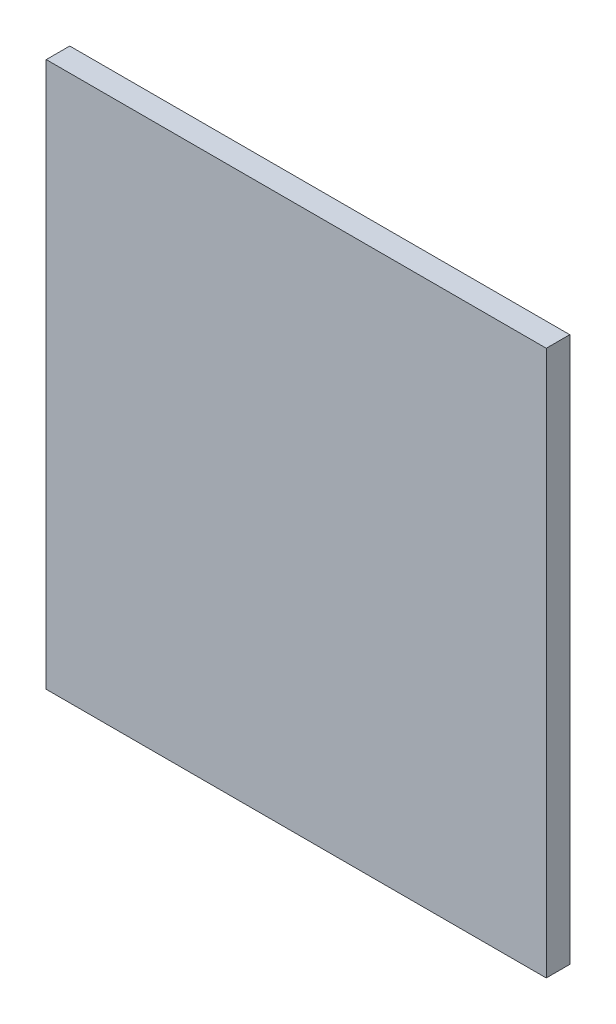
ISO-10303-21;
HEADER;
FILE_DESCRIPTION(('STEP AP214'),'2;1');
FILE_NAME('part.step','',(''),(''),'','','');
FILE_SCHEMA(('AUTOMOTIVE_DESIGN { 1 0 10303 214 1 1 1 1 }'));
ENDSEC;
DATA;
#1=APPLICATION_CONTEXT('core data for automotive mechanical design processes');
#2=APPLICATION_PROTOCOL_DEFINITION('international standard','automotive_design',2000,#1);
#3=PRODUCT_CONTEXT('',#1,'mechanical');
#4=PRODUCT('Part','Part','',(#3));
#5=PRODUCT_RELATED_PRODUCT_CATEGORY('part','',(#4));
#6=PRODUCT_DEFINITION_FORMATION('','',#4);
#7=PRODUCT_DEFINITION_CONTEXT('part definition',#1,'design');
#8=PRODUCT_DEFINITION('design','',#6,#7);
#9=PRODUCT_DEFINITION_SHAPE('','',#8);
#10=(LENGTH_UNIT() NAMED_UNIT(*) SI_UNIT(.MILLI.,.METRE.));
#11=(NAMED_UNIT(*) PLANE_ANGLE_UNIT() SI_UNIT($,.RADIAN.));
#12=(NAMED_UNIT(*) SI_UNIT($,.STERADIAN.) SOLID_ANGLE_UNIT());
#13=UNCERTAINTY_MEASURE_WITH_UNIT(LENGTH_MEASURE(1.E-05),#10,'distance_accuracy_value','');
#14=(GEOMETRIC_REPRESENTATION_CONTEXT(3) GLOBAL_UNCERTAINTY_ASSIGNED_CONTEXT((#13)) GLOBAL_UNIT_ASSIGNED_CONTEXT((#10,
#11,#12)) REPRESENTATION_CONTEXT('',''));
#15=CARTESIAN_POINT('',(0.,0.,0.));
#16=DIRECTION('',(0.,0.,1.));
#17=DIRECTION('',(1.,0.,0.));
#18=AXIS2_PLACEMENT_3D('',#15,#16,#17);
#19=CARTESIAN_POINT('',(1.0635,0.,0.05));
#20=DIRECTION('',(-1.,0.,0.));
#21=DIRECTION('',(0.,0.,1.));
#22=AXIS2_PLACEMENT_3D('',#19,#20,#21);
#23=PLANE('',#22);
#24=DIRECTION('',(0.,0.,-1.));
#25=VECTOR('',#24,1.);
#26=CARTESIAN_POINT('',(1.0635,-1.16,0.05));
#27=LINE('',#26,#25);
#28=CARTESIAN_POINT('',(1.0635,-1.16,0.1));
#29=VERTEX_POINT('',#28);
#30=CARTESIAN_POINT('',(1.0635,-1.16,0.));
#31=VERTEX_POINT('',#30);
#32=EDGE_CURVE('E68',#29,#31,#27,.T.);
#33=ORIENTED_EDGE('',*,*,#32,.T.);
#34=DIRECTION('',(0.,-1.,0.));
#35=VECTOR('',#34,1.);
#36=CARTESIAN_POINT('',(1.0635,0.,0.));
#37=LINE('',#36,#35);
#38=CARTESIAN_POINT('',(1.0635,1.16,0.));
#39=VERTEX_POINT('',#38);
#40=EDGE_CURVE('E88',#39,#31,#37,.T.);
#41=ORIENTED_EDGE('',*,*,#40,.F.);
#42=DIRECTION('',(0.,0.,-1.));
#43=VECTOR('',#42,1.);
#44=CARTESIAN_POINT('',(1.0635,1.16,0.05));
#45=LINE('',#44,#43);
#46=CARTESIAN_POINT('',(1.0635,1.16,0.1));
#47=VERTEX_POINT('',#46);
#48=EDGE_CURVE('E11',#47,#39,#45,.T.);
#49=ORIENTED_EDGE('',*,*,#48,.F.);
#50=DIRECTION('',(0.,1.,0.));
#51=VECTOR('',#50,1.);
#52=CARTESIAN_POINT('',(1.0635,0.,0.1));
#53=LINE('',#52,#51);
#54=EDGE_CURVE('E85',#29,#47,#53,.T.);
#55=ORIENTED_EDGE('',*,*,#54,.F.);
#56=EDGE_LOOP('',(#33,#41,#49,#55));
#57=FACE_BOUND('',#56,.T.);
#58=ADVANCED_FACE('F17',(#57),#23,.F.);
#59=CARTESIAN_POINT('',(0.,1.16,0.05));
#60=DIRECTION('',(0.,-1.,0.));
#61=DIRECTION('',(0.,0.,-1.));
#62=AXIS2_PLACEMENT_3D('',#59,#60,#61);
#63=PLANE('',#62);
#64=ORIENTED_EDGE('',*,*,#48,.T.);
#65=DIRECTION('',(1.,0.,0.));
#66=VECTOR('',#65,1.);
#67=CARTESIAN_POINT('',(0.,1.16,0.));
#68=LINE('',#67,#66);
#69=CARTESIAN_POINT('',(-1.0635,1.16,0.));
#70=VERTEX_POINT('',#69);
#71=EDGE_CURVE('E105',#70,#39,#68,.T.);
#72=ORIENTED_EDGE('',*,*,#71,.F.);
#73=DIRECTION('',(0.,0.,-1.));
#74=VECTOR('',#73,1.);
#75=CARTESIAN_POINT('',(-1.0635,1.16,0.05));
#76=LINE('',#75,#74);
#77=CARTESIAN_POINT('',(-1.0635,1.16,0.1));
#78=VERTEX_POINT('',#77);
#79=EDGE_CURVE('E25',#78,#70,#76,.T.);
#80=ORIENTED_EDGE('',*,*,#79,.F.);
#81=DIRECTION('',(-1.,0.,0.));
#82=VECTOR('',#81,1.);
#83=CARTESIAN_POINT('',(0.,1.16,0.1));
#84=LINE('',#83,#82);
#85=EDGE_CURVE('E92',#47,#78,#84,.T.);
#86=ORIENTED_EDGE('',*,*,#85,.F.);
#87=EDGE_LOOP('',(#64,#72,#80,#86));
#88=FACE_BOUND('',#87,.T.);
#89=ADVANCED_FACE('F156',(#88),#63,.F.);
#90=CARTESIAN_POINT('',(-1.0635,0.,0.05));
#91=DIRECTION('',(1.,0.,0.));
#92=DIRECTION('',(0.,1.,0.));
#93=AXIS2_PLACEMENT_3D('',#90,#91,#92);
#94=PLANE('',#93);
#95=ORIENTED_EDGE('',*,*,#79,.T.);
#96=DIRECTION('',(0.,1.,0.));
#97=VECTOR('',#96,1.);
#98=CARTESIAN_POINT('',(-1.0635,0.,0.));
#99=LINE('',#98,#97);
#100=CARTESIAN_POINT('',(-1.0635,-1.16,0.));
#101=VERTEX_POINT('',#100);
#102=EDGE_CURVE('E106',#101,#70,#99,.T.);
#103=ORIENTED_EDGE('',*,*,#102,.F.);
#104=DIRECTION('',(0.,0.,-1.));
#105=VECTOR('',#104,1.);
#106=CARTESIAN_POINT('',(-1.0635,-1.16,0.05));
#107=LINE('',#106,#105);
#108=CARTESIAN_POINT('',(-1.0635,-1.16,0.1));
#109=VERTEX_POINT('',#108);
#110=EDGE_CURVE('E46',#109,#101,#107,.T.);
#111=ORIENTED_EDGE('',*,*,#110,.F.);
#112=DIRECTION('',(0.,-1.,0.));
#113=VECTOR('',#112,1.);
#114=CARTESIAN_POINT('',(-1.0635,0.,0.1));
#115=LINE('',#114,#113);
#116=EDGE_CURVE('E86',#78,#109,#115,.T.);
#117=ORIENTED_EDGE('',*,*,#116,.F.);
#118=EDGE_LOOP('',(#95,#103,#111,#117));
#119=FACE_BOUND('',#118,.T.);
#120=ADVANCED_FACE('F157',(#119),#94,.F.);
#121=CARTESIAN_POINT('',(0.,-1.16,0.05));
#122=DIRECTION('',(0.,1.,0.));
#123=DIRECTION('',(1.,0.,0.));
#124=AXIS2_PLACEMENT_3D('',#121,#122,#123);
#125=PLANE('',#124);
#126=ORIENTED_EDGE('',*,*,#110,.T.);
#127=DIRECTION('',(-1.,0.,0.));
#128=VECTOR('',#127,1.);
#129=CARTESIAN_POINT('',(0.,-1.16,0.));
#130=LINE('',#129,#128);
#131=EDGE_CURVE('E74',#31,#101,#130,.T.);
#132=ORIENTED_EDGE('',*,*,#131,.F.);
#133=ORIENTED_EDGE('',*,*,#32,.F.);
#134=DIRECTION('',(1.,0.,0.));
#135=VECTOR('',#134,1.);
#136=CARTESIAN_POINT('',(0.,-1.16,0.1));
#137=LINE('',#136,#135);
#138=EDGE_CURVE('E71',#109,#29,#137,.T.);
#139=ORIENTED_EDGE('',*,*,#138,.F.);
#140=EDGE_LOOP('',(#126,#132,#133,#139));
#141=FACE_BOUND('',#140,.T.);
#142=ADVANCED_FACE('F70',(#141),#125,.F.);
#143=CARTESIAN_POINT('',(0.,0.,0.));
#144=DIRECTION('',(0.,0.,1.));
#145=DIRECTION('',(1.,0.,0.));
#146=AXIS2_PLACEMENT_3D('',#143,#144,#145);
#147=PLANE('',#146);
#148=ORIENTED_EDGE('',*,*,#40,.T.);
#149=ORIENTED_EDGE('',*,*,#131,.T.);
#150=ORIENTED_EDGE('',*,*,#102,.T.);
#151=ORIENTED_EDGE('',*,*,#71,.T.);
#152=EDGE_LOOP('',(#148,#149,#150,#151));
#153=FACE_BOUND('',#152,.T.);
#154=ADVANCED_FACE('F154',(#153),#147,.F.);
#155=CARTESIAN_POINT('',(0.,0.,0.1));
#156=DIRECTION('',(0.,0.,1.));
#157=DIRECTION('',(1.,0.,0.));
#158=AXIS2_PLACEMENT_3D('',#155,#156,#157);
#159=PLANE('',#158);
#160=ORIENTED_EDGE('',*,*,#54,.T.);
#161=ORIENTED_EDGE('',*,*,#85,.T.);
#162=ORIENTED_EDGE('',*,*,#116,.T.);
#163=ORIENTED_EDGE('',*,*,#138,.T.);
#164=EDGE_LOOP('',(#160,#161,#162,#163));
#165=FACE_BOUND('',#164,.T.);
#166=ADVANCED_FACE('F83',(#165),#159,.T.);
#167=CLOSED_SHELL('',(#58,#89,#120,#142,#154,#166));
#168=MANIFOLD_SOLID_BREP('B1',#167);
#169=ADVANCED_BREP_SHAPE_REPRESENTATION('',(#18,#168),#14);
#170=SHAPE_DEFINITION_REPRESENTATION(#9,#169);
ENDSEC;
END-ISO-10303-21;
